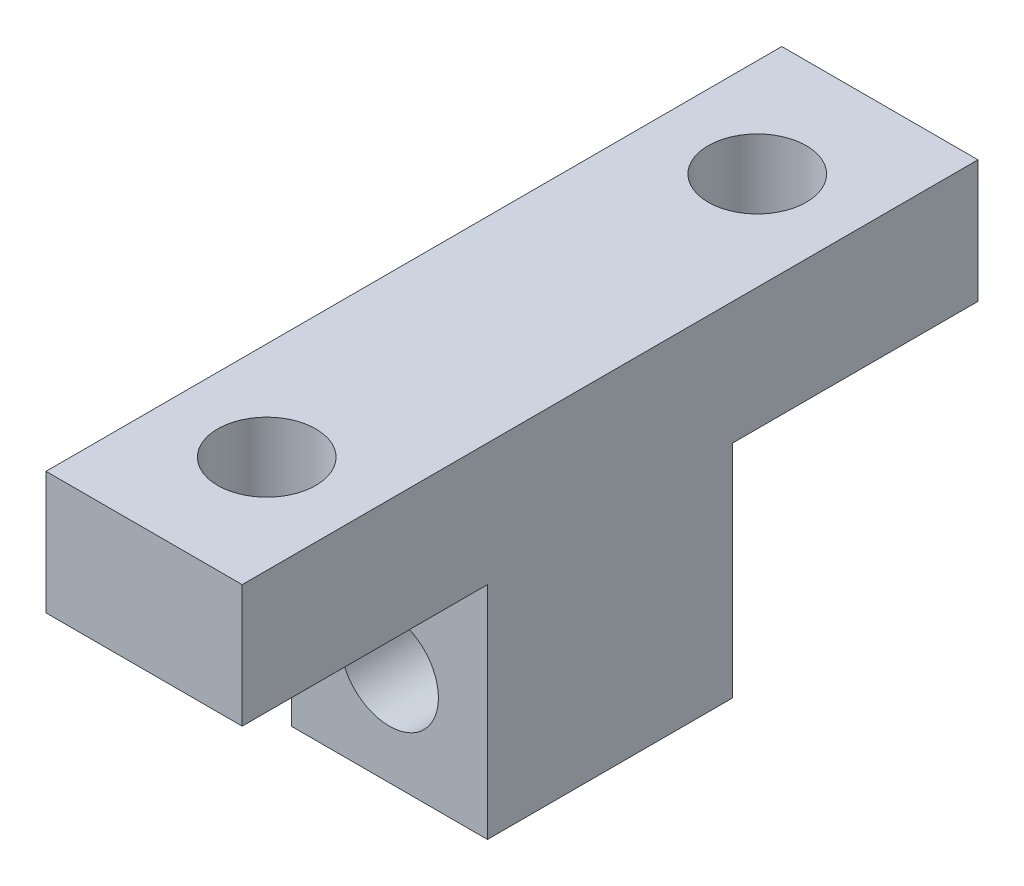
ISO-10303-21;
HEADER;
FILE_DESCRIPTION(('STEP AP214'),'2;1');
FILE_NAME('part.step','',(''),(''),'','','');
FILE_SCHEMA(('AUTOMOTIVE_DESIGN { 1 0 10303 214 1 1 1 1 }'));
ENDSEC;
DATA;
#1=APPLICATION_CONTEXT('core data for automotive mechanical design processes');
#2=APPLICATION_PROTOCOL_DEFINITION('international standard','automotive_design',2000,#1);
#3=PRODUCT_CONTEXT('',#1,'mechanical');
#4=PRODUCT('Part','Part','',(#3));
#5=PRODUCT_RELATED_PRODUCT_CATEGORY('part','',(#4));
#6=PRODUCT_DEFINITION_FORMATION('','',#4);
#7=PRODUCT_DEFINITION_CONTEXT('part definition',#1,'design');
#8=PRODUCT_DEFINITION('design','',#6,#7);
#9=PRODUCT_DEFINITION_SHAPE('','',#8);
#10=(LENGTH_UNIT() NAMED_UNIT(*) SI_UNIT(.MILLI.,.METRE.));
#11=(NAMED_UNIT(*) PLANE_ANGLE_UNIT() SI_UNIT($,.RADIAN.));
#12=(NAMED_UNIT(*) SI_UNIT($,.STERADIAN.) SOLID_ANGLE_UNIT());
#13=UNCERTAINTY_MEASURE_WITH_UNIT(LENGTH_MEASURE(1.E-05),#10,'distance_accuracy_value','');
#14=(GEOMETRIC_REPRESENTATION_CONTEXT(3) GLOBAL_UNCERTAINTY_ASSIGNED_CONTEXT((#13)) GLOBAL_UNIT_ASSIGNED_CONTEXT((#10,
#11,#12)) REPRESENTATION_CONTEXT('',''));
#15=CARTESIAN_POINT('',(0.,0.,0.));
#16=DIRECTION('',(0.,0.,1.));
#17=DIRECTION('',(1.,0.,0.));
#18=AXIS2_PLACEMENT_3D('',#15,#16,#17);
#19=CARTESIAN_POINT('',(4.,0.,15.));
#20=DIRECTION('',(0.,0.,-1.));
#21=DIRECTION('',(-1.,0.,0.));
#22=AXIS2_PLACEMENT_3D('',#19,#20,#21);
#23=PLANE('',#22);
#24=DIRECTION('',(0.,-1.,0.));
#25=VECTOR('',#24,1.);
#26=CARTESIAN_POINT('',(-4.,0.,15.));
#27=LINE('',#26,#25);
#28=CARTESIAN_POINT('',(-4.,0.,15.));
#29=VERTEX_POINT('',#28);
#30=CARTESIAN_POINT('',(-4.,-5.,15.));
#31=VERTEX_POINT('',#30);
#32=EDGE_CURVE('E138',#29,#31,#27,.T.);
#33=ORIENTED_EDGE('',*,*,#32,.T.);
#34=DIRECTION('',(-1.,0.,0.));
#35=VECTOR('',#34,1.);
#36=CARTESIAN_POINT('',(4.,-5.,15.));
#37=LINE('',#36,#35);
#38=CARTESIAN_POINT('',(4.,-5.,15.));
#39=VERTEX_POINT('',#38);
#40=EDGE_CURVE('E46',#39,#31,#37,.T.);
#41=ORIENTED_EDGE('',*,*,#40,.F.);
#42=DIRECTION('',(0.,-1.,0.));
#43=VECTOR('',#42,1.);
#44=CARTESIAN_POINT('',(4.,0.,15.));
#45=LINE('',#44,#43);
#46=CARTESIAN_POINT('',(4.,0.,15.));
#47=VERTEX_POINT('',#46);
#48=EDGE_CURVE('E98',#47,#39,#45,.T.);
#49=ORIENTED_EDGE('',*,*,#48,.F.);
#50=DIRECTION('',(-1.,0.,0.));
#51=VECTOR('',#50,1.);
#52=CARTESIAN_POINT('',(4.,0.,15.));
#53=LINE('',#52,#51);
#54=EDGE_CURVE('E11',#47,#29,#53,.T.);
#55=ORIENTED_EDGE('',*,*,#54,.T.);
#56=EDGE_LOOP('',(#33,#41,#49,#55));
#57=FACE_BOUND('',#56,.T.);
#58=ADVANCED_FACE('F37',(#57),#23,.F.);
#59=CARTESIAN_POINT('',(4.,-5.,15.));
#60=DIRECTION('',(0.,1.,0.));
#61=DIRECTION('',(0.,0.,1.));
#62=AXIS2_PLACEMENT_3D('',#59,#60,#61);
#63=PLANE('',#62);
#64=CARTESIAN_POINT('',(0.,-5.,10.));
#65=DIRECTION('',(0.,1.,0.));
#66=DIRECTION('',(0.,0.,1.));
#67=AXIS2_PLACEMENT_3D('',#64,#65,#66);
#68=CIRCLE('',#67,2.);
#69=CARTESIAN_POINT('',(0.,-5.,12.));
#70=VERTEX_POINT('',#69);
#71=EDGE_CURVE('E186',#70,#70,#68,.F.);
#72=ORIENTED_EDGE('',*,*,#71,.F.);
#73=EDGE_LOOP('',(#72));
#74=FACE_BOUND('',#73,.T.);
#75=DIRECTION('',(0.,0.,-1.));
#76=VECTOR('',#75,1.);
#77=CARTESIAN_POINT('',(-4.,-5.,15.));
#78=LINE('',#77,#76);
#79=CARTESIAN_POINT('',(-4.,-5.,5.));
#80=VERTEX_POINT('',#79);
#81=EDGE_CURVE('E140',#31,#80,#78,.T.);
#82=ORIENTED_EDGE('',*,*,#81,.T.);
#83=DIRECTION('',(-1.,0.,0.));
#84=VECTOR('',#83,1.);
#85=CARTESIAN_POINT('',(4.,-5.,5.));
#86=LINE('',#85,#84);
#87=CARTESIAN_POINT('',(4.,-5.,5.));
#88=VERTEX_POINT('',#87);
#89=EDGE_CURVE('E158',#88,#80,#86,.T.);
#90=ORIENTED_EDGE('',*,*,#89,.F.);
#91=DIRECTION('',(0.,0.,-1.));
#92=VECTOR('',#91,1.);
#93=CARTESIAN_POINT('',(4.,-5.,15.));
#94=LINE('',#93,#92);
#95=EDGE_CURVE('E167',#39,#88,#94,.T.);
#96=ORIENTED_EDGE('',*,*,#95,.F.);
#97=ORIENTED_EDGE('',*,*,#40,.T.);
#98=EDGE_LOOP('',(#82,#90,#96,#97));
#99=FACE_BOUND('',#98,.T.);
#100=ADVANCED_FACE('F165',(#74,#99),#63,.F.);
#101=CARTESIAN_POINT('',(4.,-5.,5.));
#102=DIRECTION('',(0.,0.,-1.));
#103=DIRECTION('',(0.,1.,0.));
#104=AXIS2_PLACEMENT_3D('',#101,#102,#103);
#105=PLANE('',#104);
#106=CARTESIAN_POINT('',(0.,-10.,4.99999999999999));
#107=DIRECTION('',(0.,0.,-1.));
#108=DIRECTION('',(0.,1.,0.));
#109=AXIS2_PLACEMENT_3D('',#106,#107,#108);
#110=CIRCLE('',#109,2.);
#111=CARTESIAN_POINT('',(0.,-8.,4.99999999999999));
#112=VERTEX_POINT('',#111);
#113=EDGE_CURVE('E193',#112,#112,#110,.T.);
#114=ORIENTED_EDGE('',*,*,#113,.T.);
#115=EDGE_LOOP('',(#114));
#116=FACE_BOUND('',#115,.T.);
#117=DIRECTION('',(0.,-1.,0.));
#118=VECTOR('',#117,1.);
#119=CARTESIAN_POINT('',(-4.,-5.,5.));
#120=LINE('',#119,#118);
#121=CARTESIAN_POINT('',(-4.,-14.,4.99999999999999));
#122=VERTEX_POINT('',#121);
#123=EDGE_CURVE('E143',#80,#122,#120,.T.);
#124=ORIENTED_EDGE('',*,*,#123,.T.);
#125=DIRECTION('',(-1.,0.,0.));
#126=VECTOR('',#125,1.);
#127=CARTESIAN_POINT('',(4.,-14.,4.99999999999999));
#128=LINE('',#127,#126);
#129=CARTESIAN_POINT('',(4.,-14.,4.99999999999999));
#130=VERTEX_POINT('',#129);
#131=EDGE_CURVE('E155',#130,#122,#128,.T.);
#132=ORIENTED_EDGE('',*,*,#131,.F.);
#133=DIRECTION('',(0.,-1.,0.));
#134=VECTOR('',#133,1.);
#135=CARTESIAN_POINT('',(4.,-5.,5.));
#136=LINE('',#135,#134);
#137=EDGE_CURVE('E180',#88,#130,#136,.T.);
#138=ORIENTED_EDGE('',*,*,#137,.F.);
#139=ORIENTED_EDGE('',*,*,#89,.T.);
#140=EDGE_LOOP('',(#124,#132,#138,#139));
#141=FACE_BOUND('',#140,.T.);
#142=ADVANCED_FACE('F176',(#116,#141),#105,.F.);
#143=CARTESIAN_POINT('',(4.,-14.,4.99999999999999));
#144=DIRECTION('',(0.,1.,0.));
#145=DIRECTION('',(0.,0.,1.));
#146=AXIS2_PLACEMENT_3D('',#143,#144,#145);
#147=PLANE('',#146);
#148=DIRECTION('',(0.,0.,-1.));
#149=VECTOR('',#148,1.);
#150=CARTESIAN_POINT('',(-4.,-14.,4.99999999999999));
#151=LINE('',#150,#149);
#152=CARTESIAN_POINT('',(-4.,-14.,-5.00000000000001));
#153=VERTEX_POINT('',#152);
#154=EDGE_CURVE('E145',#122,#153,#151,.T.);
#155=ORIENTED_EDGE('',*,*,#154,.T.);
#156=DIRECTION('',(-1.,0.,0.));
#157=VECTOR('',#156,1.);
#158=CARTESIAN_POINT('',(4.,-14.,-5.00000000000001));
#159=LINE('',#158,#157);
#160=CARTESIAN_POINT('',(4.,-14.,-5.00000000000001));
#161=VERTEX_POINT('',#160);
#162=EDGE_CURVE('E127',#161,#153,#159,.T.);
#163=ORIENTED_EDGE('',*,*,#162,.F.);
#164=DIRECTION('',(0.,0.,-1.));
#165=VECTOR('',#164,1.);
#166=CARTESIAN_POINT('',(4.,-14.,4.99999999999999));
#167=LINE('',#166,#165);
#168=EDGE_CURVE('E118',#130,#161,#167,.T.);
#169=ORIENTED_EDGE('',*,*,#168,.F.);
#170=ORIENTED_EDGE('',*,*,#131,.T.);
#171=EDGE_LOOP('',(#155,#163,#169,#170));
#172=FACE_BOUND('',#171,.T.);
#173=ADVANCED_FACE('F179',(#172),#147,.F.);
#174=CARTESIAN_POINT('',(4.,-5.,-5.));
#175=DIRECTION('',(0.,0.,1.));
#176=DIRECTION('',(0.,-1.,0.));
#177=AXIS2_PLACEMENT_3D('',#174,#175,#176);
#178=PLANE('',#177);
#179=CARTESIAN_POINT('',(0.,-10.,-5.));
#180=DIRECTION('',(0.,0.,1.));
#181=DIRECTION('',(0.,-1.,0.));
#182=AXIS2_PLACEMENT_3D('',#179,#180,#181);
#183=CIRCLE('',#182,2.);
#184=CARTESIAN_POINT('',(0.,-12.,-5.00000000000001));
#185=VERTEX_POINT('',#184);
#186=EDGE_CURVE('E40',#185,#185,#183,.T.);
#187=ORIENTED_EDGE('',*,*,#186,.T.);
#188=EDGE_LOOP('',(#187));
#189=FACE_BOUND('',#188,.T.);
#190=DIRECTION('',(0.,1.,0.));
#191=VECTOR('',#190,1.);
#192=CARTESIAN_POINT('',(-4.,-5.,-5.));
#193=LINE('',#192,#191);
#194=CARTESIAN_POINT('',(-4.,-5.,-5.));
#195=VERTEX_POINT('',#194);
#196=EDGE_CURVE('E126',#153,#195,#193,.T.);
#197=ORIENTED_EDGE('',*,*,#196,.T.);
#198=DIRECTION('',(-1.,0.,0.));
#199=VECTOR('',#198,1.);
#200=CARTESIAN_POINT('',(4.,-5.,-5.));
#201=LINE('',#200,#199);
#202=CARTESIAN_POINT('',(4.,-5.,-5.));
#203=VERTEX_POINT('',#202);
#204=EDGE_CURVE('E123',#203,#195,#201,.T.);
#205=ORIENTED_EDGE('',*,*,#204,.F.);
#206=DIRECTION('',(0.,1.,0.));
#207=VECTOR('',#206,1.);
#208=CARTESIAN_POINT('',(4.,-5.,-5.));
#209=LINE('',#208,#207);
#210=EDGE_CURVE('E112',#161,#203,#209,.T.);
#211=ORIENTED_EDGE('',*,*,#210,.F.);
#212=ORIENTED_EDGE('',*,*,#162,.T.);
#213=EDGE_LOOP('',(#197,#205,#211,#212));
#214=FACE_BOUND('',#213,.T.);
#215=ADVANCED_FACE('F124',(#189,#214),#178,.F.);
#216=CARTESIAN_POINT('',(4.,-5.,-15.));
#217=DIRECTION('',(0.,1.,0.));
#218=DIRECTION('',(0.,0.,1.));
#219=AXIS2_PLACEMENT_3D('',#216,#217,#218);
#220=PLANE('',#219);
#221=CARTESIAN_POINT('',(0.,-5.,-10.));
#222=DIRECTION('',(0.,1.,0.));
#223=DIRECTION('',(0.,0.,1.));
#224=AXIS2_PLACEMENT_3D('',#221,#222,#223);
#225=CIRCLE('',#224,2.);
#226=CARTESIAN_POINT('',(0.,-5.,-8.));
#227=VERTEX_POINT('',#226);
#228=EDGE_CURVE('E141',#227,#227,#225,.F.);
#229=ORIENTED_EDGE('',*,*,#228,.F.);
#230=EDGE_LOOP('',(#229));
#231=FACE_BOUND('',#230,.T.);
#232=DIRECTION('',(0.,0.,-1.));
#233=VECTOR('',#232,1.);
#234=CARTESIAN_POINT('',(-4.,-5.,-15.));
#235=LINE('',#234,#233);
#236=CARTESIAN_POINT('',(-4.,-5.,-15.));
#237=VERTEX_POINT('',#236);
#238=EDGE_CURVE('E84',#195,#237,#235,.T.);
#239=ORIENTED_EDGE('',*,*,#238,.T.);
#240=DIRECTION('',(-1.,0.,0.));
#241=VECTOR('',#240,1.);
#242=CARTESIAN_POINT('',(4.,-5.,-15.));
#243=LINE('',#242,#241);
#244=CARTESIAN_POINT('',(4.,-5.,-15.));
#245=VERTEX_POINT('',#244);
#246=EDGE_CURVE('E128',#245,#237,#243,.T.);
#247=ORIENTED_EDGE('',*,*,#246,.F.);
#248=DIRECTION('',(0.,0.,-1.));
#249=VECTOR('',#248,1.);
#250=CARTESIAN_POINT('',(4.,-5.,-15.));
#251=LINE('',#250,#249);
#252=EDGE_CURVE('E116',#203,#245,#251,.T.);
#253=ORIENTED_EDGE('',*,*,#252,.F.);
#254=ORIENTED_EDGE('',*,*,#204,.T.);
#255=EDGE_LOOP('',(#239,#247,#253,#254));
#256=FACE_BOUND('',#255,.T.);
#257=ADVANCED_FACE('F130',(#231,#256),#220,.F.);
#258=CARTESIAN_POINT('',(4.,0.,-15.));
#259=DIRECTION('',(0.,0.,1.));
#260=DIRECTION('',(1.,0.,0.));
#261=AXIS2_PLACEMENT_3D('',#258,#259,#260);
#262=PLANE('',#261);
#263=DIRECTION('',(0.,1.,0.));
#264=VECTOR('',#263,1.);
#265=CARTESIAN_POINT('',(-4.,0.,-15.));
#266=LINE('',#265,#264);
#267=CARTESIAN_POINT('',(-4.,0.,-15.));
#268=VERTEX_POINT('',#267);
#269=EDGE_CURVE('E91',#237,#268,#266,.T.);
#270=ORIENTED_EDGE('',*,*,#269,.T.);
#271=DIRECTION('',(-1.,0.,0.));
#272=VECTOR('',#271,1.);
#273=CARTESIAN_POINT('',(4.,0.,-15.));
#274=LINE('',#273,#272);
#275=CARTESIAN_POINT('',(4.,0.,-15.));
#276=VERTEX_POINT('',#275);
#277=EDGE_CURVE('E134',#276,#268,#274,.T.);
#278=ORIENTED_EDGE('',*,*,#277,.F.);
#279=DIRECTION('',(0.,1.,0.));
#280=VECTOR('',#279,1.);
#281=CARTESIAN_POINT('',(4.,0.,-15.));
#282=LINE('',#281,#280);
#283=EDGE_CURVE('E132',#245,#276,#282,.T.);
#284=ORIENTED_EDGE('',*,*,#283,.F.);
#285=ORIENTED_EDGE('',*,*,#246,.T.);
#286=EDGE_LOOP('',(#270,#278,#284,#285));
#287=FACE_BOUND('',#286,.T.);
#288=ADVANCED_FACE('F222',(#287),#262,.F.);
#289=CARTESIAN_POINT('',(4.,0.,-15.));
#290=DIRECTION('',(0.,-1.,0.));
#291=DIRECTION('',(0.,0.,-1.));
#292=AXIS2_PLACEMENT_3D('',#289,#290,#291);
#293=PLANE('',#292);
#294=CARTESIAN_POINT('',(0.,0.,-10.));
#295=DIRECTION('',(0.,1.,0.));
#296=DIRECTION('',(0.,0.,1.));
#297=AXIS2_PLACEMENT_3D('',#294,#295,#296);
#298=CIRCLE('',#297,2.);
#299=CARTESIAN_POINT('',(0.,0.,-8.));
#300=VERTEX_POINT('',#299);
#301=EDGE_CURVE('E189',#300,#300,#298,.T.);
#302=ORIENTED_EDGE('',*,*,#301,.F.);
#303=EDGE_LOOP('',(#302));
#304=FACE_BOUND('',#303,.T.);
#305=CARTESIAN_POINT('',(0.,0.,10.));
#306=DIRECTION('',(0.,1.,0.));
#307=DIRECTION('',(0.,0.,-1.));
#308=AXIS2_PLACEMENT_3D('',#305,#306,#307);
#309=CIRCLE('',#308,2.);
#310=CARTESIAN_POINT('',(0.,0.,12.));
#311=VERTEX_POINT('',#310);
#312=EDGE_CURVE('E190',#311,#311,#309,.T.);
#313=ORIENTED_EDGE('',*,*,#312,.F.);
#314=EDGE_LOOP('',(#313));
#315=FACE_BOUND('',#314,.T.);
#316=DIRECTION('',(0.,0.,1.));
#317=VECTOR('',#316,1.);
#318=CARTESIAN_POINT('',(-4.,0.,-15.));
#319=LINE('',#318,#317);
#320=EDGE_CURVE('E150',#268,#29,#319,.T.);
#321=ORIENTED_EDGE('',*,*,#320,.T.);
#322=ORIENTED_EDGE('',*,*,#54,.F.);
#323=DIRECTION('',(0.,0.,1.));
#324=VECTOR('',#323,1.);
#325=CARTESIAN_POINT('',(4.,0.,15.));
#326=LINE('',#325,#324);
#327=EDGE_CURVE('E54',#276,#47,#326,.T.);
#328=ORIENTED_EDGE('',*,*,#327,.F.);
#329=ORIENTED_EDGE('',*,*,#277,.T.);
#330=EDGE_LOOP('',(#321,#322,#328,#329));
#331=FACE_BOUND('',#330,.T.);
#332=ADVANCED_FACE('F221',(#304,#315,#331),#293,.F.);
#333=CARTESIAN_POINT('',(4.,0.,0.));
#334=DIRECTION('',(-1.,0.,0.));
#335=DIRECTION('',(0.,0.,1.));
#336=AXIS2_PLACEMENT_3D('',#333,#334,#335);
#337=PLANE('',#336);
#338=ORIENTED_EDGE('',*,*,#327,.T.);
#339=ORIENTED_EDGE('',*,*,#48,.T.);
#340=ORIENTED_EDGE('',*,*,#95,.T.);
#341=ORIENTED_EDGE('',*,*,#137,.T.);
#342=ORIENTED_EDGE('',*,*,#168,.T.);
#343=ORIENTED_EDGE('',*,*,#210,.T.);
#344=ORIENTED_EDGE('',*,*,#252,.T.);
#345=ORIENTED_EDGE('',*,*,#283,.T.);
#346=EDGE_LOOP('',(#338,#339,#340,#341,#342,#343,#344,#345));
#347=FACE_BOUND('',#346,.T.);
#348=ADVANCED_FACE('F114',(#347),#337,.F.);
#349=CARTESIAN_POINT('',(-4.,0.,0.));
#350=DIRECTION('',(-1.,0.,0.));
#351=DIRECTION('',(0.,0.,1.));
#352=AXIS2_PLACEMENT_3D('',#349,#350,#351);
#353=PLANE('',#352);
#354=ORIENTED_EDGE('',*,*,#32,.F.);
#355=ORIENTED_EDGE('',*,*,#320,.F.);
#356=ORIENTED_EDGE('',*,*,#269,.F.);
#357=ORIENTED_EDGE('',*,*,#238,.F.);
#358=ORIENTED_EDGE('',*,*,#196,.F.);
#359=ORIENTED_EDGE('',*,*,#154,.F.);
#360=ORIENTED_EDGE('',*,*,#123,.F.);
#361=ORIENTED_EDGE('',*,*,#81,.F.);
#362=EDGE_LOOP('',(#354,#355,#356,#357,#358,#359,#360,#361));
#363=FACE_BOUND('',#362,.T.);
#364=ADVANCED_FACE('F171',(#363),#353,.T.);
#365=CARTESIAN_POINT('',(0.,-14.001,10.));
#366=DIRECTION('',(0.,1.,0.));
#367=DIRECTION('',(0.,0.,1.));
#368=AXIS2_PLACEMENT_3D('',#365,#366,#367);
#369=CYLINDRICAL_SURFACE('',#368,2.);
#370=CARTESIAN_POINT('',(0.,0.,12.));
#371=CARTESIAN_POINT('',(0.,-0.0520833333333351,12.));
#372=CARTESIAN_POINT('',(0.,-0.104166666666669,12.));
#373=CARTESIAN_POINT('',(0.,-0.208333333333335,12.));
#374=CARTESIAN_POINT('',(0.,-0.260416666666669,12.));
#375=CARTESIAN_POINT('',(0.,-0.364583333333335,12.));
#376=CARTESIAN_POINT('',(0.,-0.416666666666669,12.));
#377=CARTESIAN_POINT('',(0.,-0.520833333333335,12.));
#378=CARTESIAN_POINT('',(0.,-0.572916666666669,12.));
#379=CARTESIAN_POINT('',(0.,-0.677083333333336,12.));
#380=CARTESIAN_POINT('',(0.,-0.729166666666669,12.));
#381=CARTESIAN_POINT('',(0.,-0.833333333333336,12.));
#382=CARTESIAN_POINT('',(0.,-0.885416666666669,12.));
#383=CARTESIAN_POINT('',(0.,-0.989583333333336,12.));
#384=CARTESIAN_POINT('',(0.,-1.04166666666667,12.));
#385=CARTESIAN_POINT('',(0.,-1.14583333333334,12.));
#386=CARTESIAN_POINT('',(0.,-1.19791666666667,12.));
#387=CARTESIAN_POINT('',(0.,-1.30208333333334,12.));
#388=CARTESIAN_POINT('',(0.,-1.35416666666667,12.));
#389=CARTESIAN_POINT('',(0.,-1.45833333333334,12.));
#390=CARTESIAN_POINT('',(0.,-1.51041666666667,12.));
#391=CARTESIAN_POINT('',(0.,-1.61458333333333,12.));
#392=CARTESIAN_POINT('',(0.,-1.66666666666667,12.));
#393=CARTESIAN_POINT('',(0.,-1.77083333333334,12.));
#394=CARTESIAN_POINT('',(0.,-1.82291666666667,12.));
#395=CARTESIAN_POINT('',(0.,-1.92708333333334,12.));
#396=CARTESIAN_POINT('',(0.,-1.97916666666667,12.));
#397=CARTESIAN_POINT('',(0.,-2.08333333333334,12.));
#398=CARTESIAN_POINT('',(0.,-2.13541666666667,12.));
#399=CARTESIAN_POINT('',(0.,-2.23958333333334,12.));
#400=CARTESIAN_POINT('',(0.,-2.29166666666667,12.));
#401=CARTESIAN_POINT('',(0.,-2.39583333333334,12.));
#402=CARTESIAN_POINT('',(0.,-2.44791666666667,12.));
#403=CARTESIAN_POINT('',(0.,-2.55208333333334,12.));
#404=CARTESIAN_POINT('',(0.,-2.60416666666667,12.));
#405=CARTESIAN_POINT('',(0.,-2.70833333333334,12.));
#406=CARTESIAN_POINT('',(0.,-2.76041666666667,12.));
#407=CARTESIAN_POINT('',(0.,-2.86458333333334,12.));
#408=CARTESIAN_POINT('',(0.,-2.91666666666667,12.));
#409=CARTESIAN_POINT('',(0.,-3.02083333333334,12.));
#410=CARTESIAN_POINT('',(0.,-3.07291666666667,12.));
#411=CARTESIAN_POINT('',(0.,-3.17708333333334,12.));
#412=CARTESIAN_POINT('',(0.,-3.22916666666667,12.));
#413=CARTESIAN_POINT('',(0.,-3.33333333333334,12.));
#414=CARTESIAN_POINT('',(0.,-3.38541666666667,12.));
#415=CARTESIAN_POINT('',(0.,-3.48958333333333,12.));
#416=CARTESIAN_POINT('',(0.,-3.54166666666667,12.));
#417=CARTESIAN_POINT('',(0.,-3.64583333333333,12.));
#418=CARTESIAN_POINT('',(0.,-3.69791666666667,12.));
#419=CARTESIAN_POINT('',(0.,-3.80208333333333,12.));
#420=CARTESIAN_POINT('',(0.,-3.85416666666667,12.));
#421=CARTESIAN_POINT('',(0.,-3.95833333333334,12.));
#422=CARTESIAN_POINT('',(0.,-4.01041666666667,12.));
#423=CARTESIAN_POINT('',(0.,-4.11458333333334,12.));
#424=CARTESIAN_POINT('',(0.,-4.16666666666667,12.));
#425=CARTESIAN_POINT('',(0.,-4.27083333333334,12.));
#426=CARTESIAN_POINT('',(0.,-4.32291666666667,12.));
#427=CARTESIAN_POINT('',(0.,-4.42708333333334,12.));
#428=CARTESIAN_POINT('',(0.,-4.47916666666667,12.));
#429=CARTESIAN_POINT('',(0.,-4.58333333333334,12.));
#430=CARTESIAN_POINT('',(0.,-4.63541666666667,12.));
#431=CARTESIAN_POINT('',(0.,-4.73958333333334,12.));
#432=CARTESIAN_POINT('',(0.,-4.79166666666667,12.));
#433=CARTESIAN_POINT('',(0.,-4.89583333333334,12.));
#434=CARTESIAN_POINT('',(0.,-4.94791666666667,12.));
#435=CARTESIAN_POINT('',(0.,-5.,12.));
#436=B_SPLINE_CURVE_WITH_KNOTS('',3,(#370,#371,#372,#373,#374,#375,#376,#377,#378,#379,#380,
#381,#382,#383,#384,#385,#386,#387,#388,#389,#390,#391,#392,#393,#394,#395,#396,#397,#398,#399,
#400,#401,#402,#403,#404,#405,#406,#407,#408,#409,#410,#411,#412,#413,#414,#415,#416,#417,#418,
#419,#420,#421,#422,#423,#424,#425,#426,#427,#428,#429,#430,#431,#432,#433,#434,#435),
.UNSPECIFIED.,.F.,.F.,(4,2,2,2,2,2,2,2,2,2,2,2,2,2,2,2,2,2,2,2,2,2,2,2,2,2,2,2,2,2,2,2,4),(0.,
0.15625,0.3125,0.46875,0.625000000000001,0.781250000000001,0.937500000000001,1.09375,1.25,
1.40625,1.5625,1.71875,1.875,2.03125,2.1875,2.34375,2.5,2.65625,2.8125,2.96875,3.125,3.28125,
3.4375,3.59375,3.75,3.90625,4.0625,4.21875,4.375,4.53125,4.6875,4.84375,5.),.UNSPECIFIED.);
#437=EDGE_CURVE('BSEAM213',#311,#70,#436,.T.);
#438=ORIENTED_EDGE('',*,*,#312,.T.);
#439=ORIENTED_EDGE('',*,*,#71,.T.);
#440=ORIENTED_EDGE('',*,*,#437,.T.);
#441=ORIENTED_EDGE('',*,*,#437,.F.);
#442=EDGE_LOOP('',(#438,#440,#439,#441));
#443=FACE_BOUND('',#442,.T.);
#444=ADVANCED_FACE('F213',(#443),#369,.F.);
#445=CARTESIAN_POINT('',(0.,-14.001,-10.));
#446=DIRECTION('',(0.,1.,0.));
#447=DIRECTION('',(0.,0.,1.));
#448=AXIS2_PLACEMENT_3D('',#445,#446,#447);
#449=CYLINDRICAL_SURFACE('',#448,2.);
#450=CARTESIAN_POINT('',(0.,0.,-8.));
#451=CARTESIAN_POINT('',(0.,-0.0520833333333351,-8.));
#452=CARTESIAN_POINT('',(0.,-0.104166666666669,-8.));
#453=CARTESIAN_POINT('',(0.,-0.208333333333335,-8.));
#454=CARTESIAN_POINT('',(0.,-0.260416666666669,-8.));
#455=CARTESIAN_POINT('',(0.,-0.364583333333335,-8.));
#456=CARTESIAN_POINT('',(0.,-0.416666666666669,-8.));
#457=CARTESIAN_POINT('',(0.,-0.520833333333335,-8.));
#458=CARTESIAN_POINT('',(0.,-0.572916666666669,-8.));
#459=CARTESIAN_POINT('',(0.,-0.677083333333335,-8.));
#460=CARTESIAN_POINT('',(0.,-0.729166666666668,-8.));
#461=CARTESIAN_POINT('',(0.,-0.833333333333334,-8.));
#462=CARTESIAN_POINT('',(0.,-0.885416666666668,-8.));
#463=CARTESIAN_POINT('',(0.,-0.989583333333334,-8.));
#464=CARTESIAN_POINT('',(0.,-1.04166666666667,-8.));
#465=CARTESIAN_POINT('',(0.,-1.14583333333333,-8.));
#466=CARTESIAN_POINT('',(0.,-1.19791666666667,-8.));
#467=CARTESIAN_POINT('',(0.,-1.30208333333333,-8.));
#468=CARTESIAN_POINT('',(0.,-1.35416666666667,-8.));
#469=CARTESIAN_POINT('',(0.,-1.45833333333333,-8.));
#470=CARTESIAN_POINT('',(0.,-1.51041666666667,-8.));
#471=CARTESIAN_POINT('',(0.,-1.61458333333333,-8.));
#472=CARTESIAN_POINT('',(0.,-1.66666666666667,-8.));
#473=CARTESIAN_POINT('',(0.,-1.77083333333333,-8.));
#474=CARTESIAN_POINT('',(0.,-1.82291666666667,-8.));
#475=CARTESIAN_POINT('',(0.,-1.92708333333333,-8.));
#476=CARTESIAN_POINT('',(0.,-1.97916666666667,-8.));
#477=CARTESIAN_POINT('',(0.,-2.08333333333333,-8.));
#478=CARTESIAN_POINT('',(0.,-2.13541666666667,-8.));
#479=CARTESIAN_POINT('',(0.,-2.23958333333333,-8.));
#480=CARTESIAN_POINT('',(0.,-2.29166666666667,-8.));
#481=CARTESIAN_POINT('',(0.,-2.39583333333333,-8.));
#482=CARTESIAN_POINT('',(0.,-2.44791666666667,-8.));
#483=CARTESIAN_POINT('',(0.,-2.55208333333333,-8.));
#484=CARTESIAN_POINT('',(0.,-2.60416666666667,-8.));
#485=CARTESIAN_POINT('',(0.,-2.70833333333333,-8.));
#486=CARTESIAN_POINT('',(0.,-2.76041666666667,-8.));
#487=CARTESIAN_POINT('',(0.,-2.86458333333333,-8.));
#488=CARTESIAN_POINT('',(0.,-2.91666666666667,-8.));
#489=CARTESIAN_POINT('',(0.,-3.02083333333333,-8.));
#490=CARTESIAN_POINT('',(0.,-3.07291666666667,-8.));
#491=CARTESIAN_POINT('',(0.,-3.17708333333333,-8.));
#492=CARTESIAN_POINT('',(0.,-3.22916666666667,-8.));
#493=CARTESIAN_POINT('',(0.,-3.33333333333333,-8.));
#494=CARTESIAN_POINT('',(0.,-3.38541666666667,-8.));
#495=CARTESIAN_POINT('',(0.,-3.48958333333333,-8.));
#496=CARTESIAN_POINT('',(0.,-3.54166666666667,-8.));
#497=CARTESIAN_POINT('',(0.,-3.64583333333333,-8.));
#498=CARTESIAN_POINT('',(0.,-3.69791666666667,-8.));
#499=CARTESIAN_POINT('',(0.,-3.80208333333333,-8.));
#500=CARTESIAN_POINT('',(0.,-3.85416666666667,-8.));
#501=CARTESIAN_POINT('',(0.,-3.95833333333333,-8.));
#502=CARTESIAN_POINT('',(0.,-4.01041666666667,-8.));
#503=CARTESIAN_POINT('',(0.,-4.11458333333333,-8.));
#504=CARTESIAN_POINT('',(0.,-4.16666666666667,-8.));
#505=CARTESIAN_POINT('',(0.,-4.27083333333333,-8.));
#506=CARTESIAN_POINT('',(0.,-4.32291666666667,-8.));
#507=CARTESIAN_POINT('',(0.,-4.42708333333333,-8.));
#508=CARTESIAN_POINT('',(0.,-4.47916666666667,-8.));
#509=CARTESIAN_POINT('',(0.,-4.58333333333333,-8.));
#510=CARTESIAN_POINT('',(0.,-4.63541666666667,-8.));
#511=CARTESIAN_POINT('',(0.,-4.73958333333333,-8.));
#512=CARTESIAN_POINT('',(0.,-4.79166666666667,-8.));
#513=CARTESIAN_POINT('',(0.,-4.89583333333333,-8.));
#514=CARTESIAN_POINT('',(0.,-4.94791666666667,-8.));
#515=CARTESIAN_POINT('',(0.,-5.,-8.));
#516=B_SPLINE_CURVE_WITH_KNOTS('',3,(#450,#451,#452,#453,#454,#455,#456,#457,#458,#459,#460,
#461,#462,#463,#464,#465,#466,#467,#468,#469,#470,#471,#472,#473,#474,#475,#476,#477,#478,#479,
#480,#481,#482,#483,#484,#485,#486,#487,#488,#489,#490,#491,#492,#493,#494,#495,#496,#497,#498,
#499,#500,#501,#502,#503,#504,#505,#506,#507,#508,#509,#510,#511,#512,#513,#514,#515),
.UNSPECIFIED.,.F.,.F.,(4,2,2,2,2,2,2,2,2,2,2,2,2,2,2,2,2,2,2,2,2,2,2,2,2,2,2,2,2,2,2,2,4),(0.,
0.15625,0.3125,0.46875,0.625000000000001,0.781249999999999,0.937499999999999,1.09375,1.25,
1.40625,1.5625,1.71875,1.875,2.03125,2.1875,2.34375,2.5,2.65625,2.8125,2.96875,3.125,3.28125,
3.4375,3.59375,3.75,3.90625,4.0625,4.21875,4.375,4.53125,4.6875,4.84375,5.),.UNSPECIFIED.);
#517=EDGE_CURVE('BSEAM208',#300,#227,#516,.T.);
#518=ORIENTED_EDGE('',*,*,#301,.T.);
#519=ORIENTED_EDGE('',*,*,#228,.T.);
#520=ORIENTED_EDGE('',*,*,#517,.T.);
#521=ORIENTED_EDGE('',*,*,#517,.F.);
#522=EDGE_LOOP('',(#518,#520,#519,#521));
#523=FACE_BOUND('',#522,.T.);
#524=ADVANCED_FACE('F208',(#523),#449,.F.);
#525=CARTESIAN_POINT('',(0.,-10.,-15.));
#526=DIRECTION('',(0.,0.,1.));
#527=DIRECTION('',(1.,0.,0.));
#528=AXIS2_PLACEMENT_3D('',#525,#526,#527);
#529=CYLINDRICAL_SURFACE('',#528,2.);
#530=ORIENTED_EDGE('',*,*,#186,.F.);
#531=EDGE_LOOP('',(#530));
#532=FACE_BOUND('',#531,.T.);
#533=ORIENTED_EDGE('',*,*,#113,.F.);
#534=EDGE_LOOP('',(#533));
#535=FACE_BOUND('',#534,.T.);
#536=ADVANCED_FACE('F205',(#532,#535),#529,.F.);
#537=CLOSED_SHELL('',(#58,#100,#142,#173,#215,#257,#288,#332,#348,#364,#444,#524,#536));
#538=MANIFOLD_SOLID_BREP('B2',#537);
#539=ADVANCED_BREP_SHAPE_REPRESENTATION('',(#18,#538),#14);
#540=SHAPE_DEFINITION_REPRESENTATION(#9,#539);
ENDSEC;
END-ISO-10303-21;
